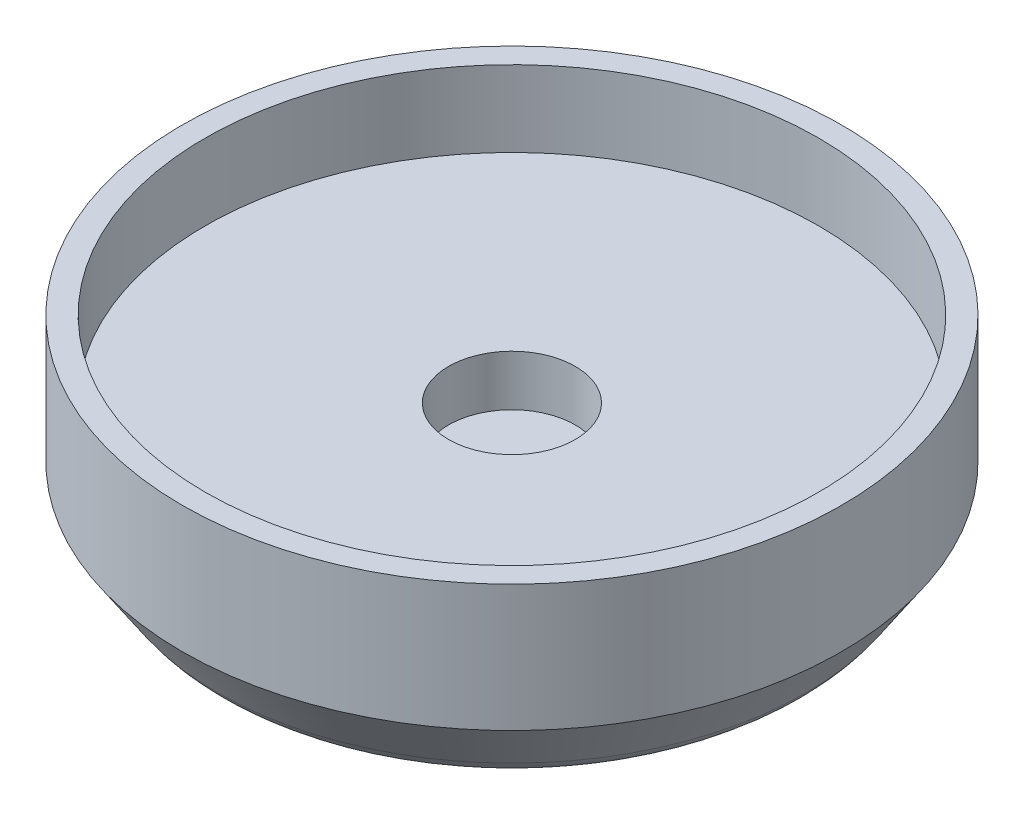
ISO-10303-21;
HEADER;
FILE_DESCRIPTION(('STEP AP214'),'2;1');
FILE_NAME('part.step','',(''),(''),'','','');
FILE_SCHEMA(('AUTOMOTIVE_DESIGN { 1 0 10303 214 1 1 1 1 }'));
ENDSEC;
DATA;
#1=APPLICATION_CONTEXT('core data for automotive mechanical design processes');
#2=APPLICATION_PROTOCOL_DEFINITION('international standard','automotive_design',2000,#1);
#3=PRODUCT_CONTEXT('',#1,'mechanical');
#4=PRODUCT('Part','Part','',(#3));
#5=PRODUCT_RELATED_PRODUCT_CATEGORY('part','',(#4));
#6=PRODUCT_DEFINITION_FORMATION('','',#4);
#7=PRODUCT_DEFINITION_CONTEXT('part definition',#1,'design');
#8=PRODUCT_DEFINITION('design','',#6,#7);
#9=PRODUCT_DEFINITION_SHAPE('','',#8);
#10=(LENGTH_UNIT() NAMED_UNIT(*) SI_UNIT(.MILLI.,.METRE.));
#11=(NAMED_UNIT(*) PLANE_ANGLE_UNIT() SI_UNIT($,.RADIAN.));
#12=(NAMED_UNIT(*) SI_UNIT($,.STERADIAN.) SOLID_ANGLE_UNIT());
#13=UNCERTAINTY_MEASURE_WITH_UNIT(LENGTH_MEASURE(1.E-05),#10,'distance_accuracy_value','');
#14=(GEOMETRIC_REPRESENTATION_CONTEXT(3) GLOBAL_UNCERTAINTY_ASSIGNED_CONTEXT((#13)) GLOBAL_UNIT_ASSIGNED_CONTEXT((#10,
#11,#12)) REPRESENTATION_CONTEXT('',''));
#15=CARTESIAN_POINT('',(0.,0.,0.));
#16=DIRECTION('',(0.,0.,1.));
#17=DIRECTION('',(1.,0.,0.));
#18=AXIS2_PLACEMENT_3D('',#15,#16,#17);
#19=CARTESIAN_POINT('',(0.,5.,0.));
#20=DIRECTION('',(0.,-1.,0.));
#21=DIRECTION('',(0.,0.,-1.));
#22=AXIS2_PLACEMENT_3D('',#19,#20,#21);
#23=CYLINDRICAL_SURFACE('',#22,13.);
#24=CARTESIAN_POINT('',(0.,5.,0.));
#25=DIRECTION('',(0.,1.,0.));
#26=DIRECTION('',(0.,0.,1.));
#27=AXIS2_PLACEMENT_3D('',#24,#25,#26);
#28=CIRCLE('',#27,13.);
#29=CARTESIAN_POINT('',(0.,5.,13.));
#30=VERTEX_POINT('',#29);
#31=EDGE_CURVE('E54',#30,#30,#28,.T.);
#32=ORIENTED_EDGE('',*,*,#31,.F.);
#33=EDGE_LOOP('',(#32));
#34=FACE_BOUND('',#33,.T.);
#35=CARTESIAN_POINT('',(0.,0.,0.));
#36=DIRECTION('',(0.,1.,0.));
#37=DIRECTION('',(0.,0.,1.));
#38=AXIS2_PLACEMENT_3D('',#35,#36,#37);
#39=CIRCLE('',#38,13.);
#40=CARTESIAN_POINT('',(0.,0.,13.));
#41=VERTEX_POINT('',#40);
#42=EDGE_CURVE('E66',#41,#41,#39,.T.);
#43=ORIENTED_EDGE('',*,*,#42,.T.);
#44=EDGE_LOOP('',(#43));
#45=FACE_BOUND('',#44,.T.);
#46=ADVANCED_FACE('F41',(#34,#45),#23,.T.);
#47=CARTESIAN_POINT('',(0.,5.,0.));
#48=DIRECTION('',(0.,1.,0.));
#49=DIRECTION('',(0.,0.,1.));
#50=AXIS2_PLACEMENT_3D('',#47,#48,#49);
#51=PLANE('',#50);
#52=CARTESIAN_POINT('',(0.,5.,0.));
#53=DIRECTION('',(0.,1.,0.));
#54=DIRECTION('',(0.,0.,1.));
#55=AXIS2_PLACEMENT_3D('',#52,#53,#54);
#56=CIRCLE('',#55,12.1);
#57=CARTESIAN_POINT('',(0.,5.,12.1));
#58=VERTEX_POINT('',#57);
#59=EDGE_CURVE('E73',#58,#58,#56,.T.);
#60=ORIENTED_EDGE('',*,*,#59,.F.);
#61=EDGE_LOOP('',(#60));
#62=FACE_BOUND('',#61,.T.);
#63=ORIENTED_EDGE('',*,*,#31,.T.);
#64=EDGE_LOOP('',(#63));
#65=FACE_BOUND('',#64,.T.);
#66=ADVANCED_FACE('F85',(#62,#65),#51,.T.);
#67=CARTESIAN_POINT('',(0.,-3.,0.));
#68=DIRECTION('',(0.,-1.,0.));
#69=DIRECTION('',(0.,0.,-1.));
#70=AXIS2_PLACEMENT_3D('',#67,#68,#69);
#71=PLANE('',#70);
#72=CARTESIAN_POINT('',(0.,-3.,0.));
#73=DIRECTION('',(0.,-1.,0.));
#74=DIRECTION('',(0.,0.,-1.));
#75=AXIS2_PLACEMENT_3D('',#72,#73,#74);
#76=CIRCLE('',#75,9.92963248302401);
#77=CARTESIAN_POINT('',(0.,-3.,-9.92963248302401));
#78=VERTEX_POINT('',#77);
#79=EDGE_CURVE('E49',#78,#78,#76,.T.);
#80=ORIENTED_EDGE('',*,*,#79,.T.);
#81=EDGE_LOOP('',(#80));
#82=FACE_BOUND('',#81,.T.);
#83=ADVANCED_FACE('F88',(#82),#71,.T.);
#84=CARTESIAN_POINT('',(0.,-3.,0.));
#85=DIRECTION('',(0.,1.,0.));
#86=DIRECTION('',(0.,0.,1.));
#87=AXIS2_PLACEMENT_3D('',#84,#85,#86);
#88=CONICAL_SURFACE('',#87,11.,0.588002603547568);
#89=CARTESIAN_POINT('',(0.,-2.10940039245046,0.));
#90=DIRECTION('',(0.,-1.,0.));
#91=DIRECTION('',(0.,0.,-1.));
#92=AXIS2_PLACEMENT_3D('',#89,#90,#91);
#93=CIRCLE('',#92,11.5937330716997);
#94=CARTESIAN_POINT('',(0.,-2.10940039245046,-11.5937330716997));
#95=VERTEX_POINT('',#94);
#96=EDGE_CURVE('E11',#95,#95,#93,.F.);
#97=ORIENTED_EDGE('',*,*,#96,.T.);
#98=EDGE_LOOP('',(#97));
#99=FACE_BOUND('',#98,.T.);
#100=ORIENTED_EDGE('',*,*,#42,.F.);
#101=EDGE_LOOP('',(#100));
#102=FACE_BOUND('',#101,.T.);
#103=ADVANCED_FACE('F96',(#99,#102),#88,.T.);
#104=CARTESIAN_POINT('',(0.,-1.,0.));
#105=DIRECTION('',(0.,-1.,0.));
#106=DIRECTION('',(0.,0.,-1.));
#107=AXIS2_PLACEMENT_3D('',#104,#105,#106);
#108=TOROIDAL_SURFACE('',#107,9.92963248302401,2.);
#109=ORIENTED_EDGE('',*,*,#96,.F.);
#110=EDGE_LOOP('',(#109));
#111=FACE_BOUND('',#110,.T.);
#112=ORIENTED_EDGE('',*,*,#79,.F.);
#113=EDGE_LOOP('',(#112));
#114=FACE_BOUND('',#113,.T.);
#115=ADVANCED_FACE('F43',(#111,#114),#108,.T.);
#116=CARTESIAN_POINT('',(0.,5.,0.));
#117=DIRECTION('',(0.,-1.,0.));
#118=DIRECTION('',(0.,0.,-1.));
#119=AXIS2_PLACEMENT_3D('',#116,#117,#118);
#120=CYLINDRICAL_SURFACE('',#119,12.1);
#121=ORIENTED_EDGE('',*,*,#59,.T.);
#122=EDGE_LOOP('',(#121));
#123=FACE_BOUND('',#122,.T.);
#124=CARTESIAN_POINT('',(0.,2.,0.));
#125=DIRECTION('',(0.,1.,0.));
#126=DIRECTION('',(0.,0.,1.));
#127=AXIS2_PLACEMENT_3D('',#124,#125,#126);
#128=CIRCLE('',#127,12.1);
#129=CARTESIAN_POINT('',(0.,2.,12.1));
#130=VERTEX_POINT('',#129);
#131=EDGE_CURVE('E74',#130,#130,#128,.T.);
#132=ORIENTED_EDGE('',*,*,#131,.F.);
#133=EDGE_LOOP('',(#132));
#134=FACE_BOUND('',#133,.T.);
#135=ADVANCED_FACE('F82',(#123,#134),#120,.F.);
#136=CARTESIAN_POINT('',(0.,0.,0.));
#137=DIRECTION('',(0.,1.,0.));
#138=DIRECTION('',(0.,0.,1.));
#139=AXIS2_PLACEMENT_3D('',#136,#137,#138);
#140=PLANE('',#139);
#141=CARTESIAN_POINT('',(0.,0.,0.));
#142=DIRECTION('',(0.,1.,0.));
#143=DIRECTION('',(0.,0.,1.));
#144=AXIS2_PLACEMENT_3D('',#141,#142,#143);
#145=CIRCLE('',#144,2.5);
#146=CARTESIAN_POINT('',(0.,0.,2.5));
#147=VERTEX_POINT('',#146);
#148=EDGE_CURVE('E59',#147,#147,#145,.T.);
#149=ORIENTED_EDGE('',*,*,#148,.T.);
#150=EDGE_LOOP('',(#149));
#151=FACE_BOUND('',#150,.T.);
#152=ADVANCED_FACE('F107',(#151),#140,.T.);
#153=CARTESIAN_POINT('',(0.,0.,0.));
#154=DIRECTION('',(0.,1.,0.));
#155=DIRECTION('',(0.,0.,1.));
#156=AXIS2_PLACEMENT_3D('',#153,#154,#155);
#157=CYLINDRICAL_SURFACE('',#156,2.5);
#158=ORIENTED_EDGE('',*,*,#148,.F.);
#159=EDGE_LOOP('',(#158));
#160=FACE_BOUND('',#159,.T.);
#161=CARTESIAN_POINT('',(0.,2.,0.));
#162=DIRECTION('',(0.,1.,0.));
#163=DIRECTION('',(0.,0.,1.));
#164=AXIS2_PLACEMENT_3D('',#161,#162,#163);
#165=CIRCLE('',#164,2.5);
#166=CARTESIAN_POINT('',(0.,2.,2.5));
#167=VERTEX_POINT('',#166);
#168=EDGE_CURVE('E62',#167,#167,#165,.T.);
#169=ORIENTED_EDGE('',*,*,#168,.T.);
#170=EDGE_LOOP('',(#169));
#171=FACE_BOUND('',#170,.T.);
#172=ADVANCED_FACE('F110',(#160,#171),#157,.F.);
#173=CARTESIAN_POINT('',(0.,2.,0.));
#174=DIRECTION('',(0.,1.,0.));
#175=DIRECTION('',(0.,0.,1.));
#176=AXIS2_PLACEMENT_3D('',#173,#174,#175);
#177=PLANE('',#176);
#178=ORIENTED_EDGE('',*,*,#168,.F.);
#179=EDGE_LOOP('',(#178));
#180=FACE_BOUND('',#179,.T.);
#181=ORIENTED_EDGE('',*,*,#131,.T.);
#182=EDGE_LOOP('',(#181));
#183=FACE_BOUND('',#182,.T.);
#184=ADVANCED_FACE('F114',(#180,#183),#177,.T.);
#185=CLOSED_SHELL('',(#46,#66,#83,#103,#115,#135,#152,#172,#184));
#186=MANIFOLD_SOLID_BREP('B2',#185);
#187=ADVANCED_BREP_SHAPE_REPRESENTATION('',(#18,#186),#14);
#188=SHAPE_DEFINITION_REPRESENTATION(#9,#187);
ENDSEC;
END-ISO-10303-21;
